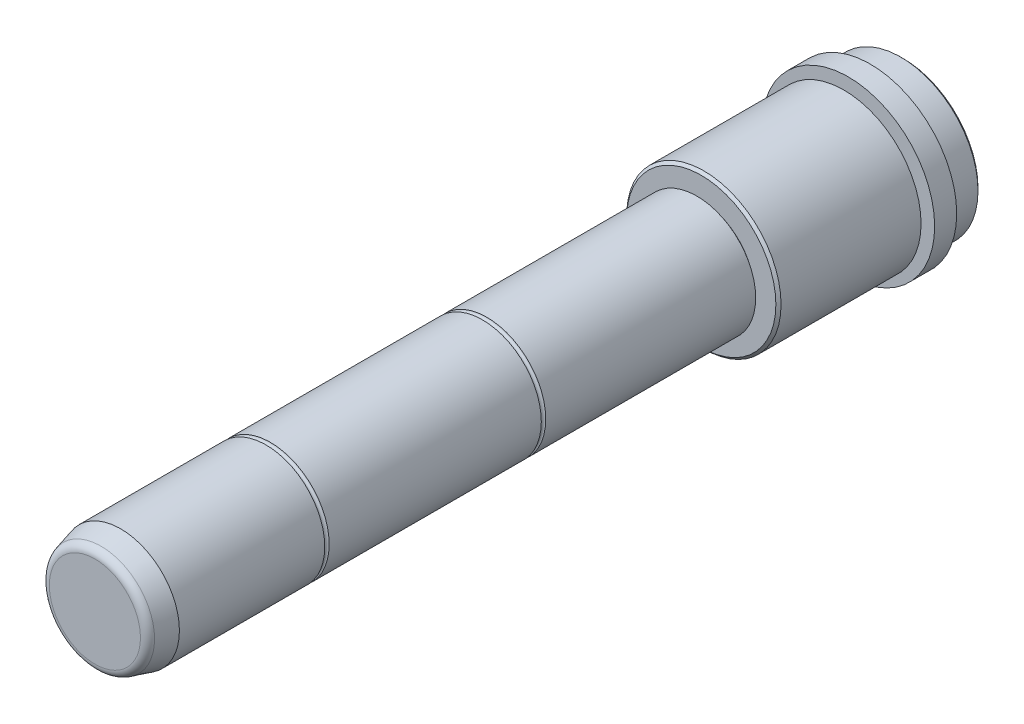
ISO-10303-21;
HEADER;
FILE_DESCRIPTION(('STEP AP214'),'2;1');
FILE_NAME('part.step','',(''),(''),'','','');
FILE_SCHEMA(('AUTOMOTIVE_DESIGN { 1 0 10303 214 1 1 1 1 }'));
ENDSEC;
DATA;
#1=APPLICATION_CONTEXT('core data for automotive mechanical design processes');
#2=APPLICATION_PROTOCOL_DEFINITION('international standard','automotive_design',2000,#1);
#3=PRODUCT_CONTEXT('',#1,'mechanical');
#4=PRODUCT('Part','Part','',(#3));
#5=PRODUCT_RELATED_PRODUCT_CATEGORY('part','',(#4));
#6=PRODUCT_DEFINITION_FORMATION('','',#4);
#7=PRODUCT_DEFINITION_CONTEXT('part definition',#1,'design');
#8=PRODUCT_DEFINITION('design','',#6,#7);
#9=PRODUCT_DEFINITION_SHAPE('','',#8);
#10=(LENGTH_UNIT() NAMED_UNIT(*) SI_UNIT(.MILLI.,.METRE.));
#11=(NAMED_UNIT(*) PLANE_ANGLE_UNIT() SI_UNIT($,.RADIAN.));
#12=(NAMED_UNIT(*) SI_UNIT($,.STERADIAN.) SOLID_ANGLE_UNIT());
#13=UNCERTAINTY_MEASURE_WITH_UNIT(LENGTH_MEASURE(1.E-05),#10,'distance_accuracy_value','');
#14=(GEOMETRIC_REPRESENTATION_CONTEXT(3) GLOBAL_UNCERTAINTY_ASSIGNED_CONTEXT((#13)) GLOBAL_UNIT_ASSIGNED_CONTEXT((#10,
#11,#12)) REPRESENTATION_CONTEXT('',''));
#15=CARTESIAN_POINT('',(0.,0.,0.));
#16=DIRECTION('',(0.,0.,1.));
#17=DIRECTION('',(1.,0.,0.));
#18=AXIS2_PLACEMENT_3D('',#15,#16,#17);
#19=CARTESIAN_POINT('',(0.,0.,55.));
#20=DIRECTION('',(0.,0.,1.));
#21=DIRECTION('',(1.,0.,0.));
#22=AXIS2_PLACEMENT_3D('',#19,#20,#21);
#23=CYLINDRICAL_SURFACE('',#22,16.);
#24=CARTESIAN_POINT('',(-1.99840144432528E-12,0.,56.2));
#25=DIRECTION('',(0.,0.,1.));
#26=DIRECTION('',(1.,0.,0.));
#27=AXIS2_PLACEMENT_3D('',#24,#25,#26);
#28=CIRCLE('',#27,16.);
#29=CARTESIAN_POINT('',(15.999999999998,0.,56.2));
#30=VERTEX_POINT('',#29);
#31=EDGE_CURVE('E82',#30,#30,#28,.T.);
#32=ORIENTED_EDGE('',*,*,#31,.T.);
#33=EDGE_LOOP('',(#32));
#34=FACE_BOUND('',#33,.T.);
#35=CARTESIAN_POINT('',(0.,0.,113.328570957142));
#36=DIRECTION('',(0.,0.,1.));
#37=DIRECTION('',(1.,0.,0.));
#38=AXIS2_PLACEMENT_3D('',#35,#36,#37);
#39=CIRCLE('',#38,16.);
#40=CARTESIAN_POINT('',(16.,0.,113.328570957142));
#41=VERTEX_POINT('',#40);
#42=EDGE_CURVE('E100',#41,#41,#39,.T.);
#43=ORIENTED_EDGE('',*,*,#42,.F.);
#44=EDGE_LOOP('',(#43));
#45=FACE_BOUND('',#44,.T.);
#46=ADVANCED_FACE('F32',(#34,#45),#23,.T.);
#47=CARTESIAN_POINT('',(0.,0.,55.));
#48=DIRECTION('',(0.,0.,-1.));
#49=DIRECTION('',(-1.,0.,0.));
#50=AXIS2_PLACEMENT_3D('',#47,#48,#49);
#51=PLANE('',#50);
#52=CARTESIAN_POINT('',(0.,0.,55.));
#53=DIRECTION('',(0.,0.,1.));
#54=DIRECTION('',(1.,0.,0.));
#55=AXIS2_PLACEMENT_3D('',#52,#53,#54);
#56=CIRCLE('',#55,20.2928932188134);
#57=CARTESIAN_POINT('',(20.2928932188134,0.,55.));
#58=VERTEX_POINT('',#57);
#59=EDGE_CURVE('E73',#58,#58,#56,.T.);
#60=ORIENTED_EDGE('',*,*,#59,.T.);
#61=EDGE_LOOP('',(#60));
#62=FACE_BOUND('',#61,.T.);
#63=CARTESIAN_POINT('',(0.,0.,55.));
#64=DIRECTION('',(0.,0.,1.));
#65=DIRECTION('',(1.,0.,0.));
#66=AXIS2_PLACEMENT_3D('',#63,#64,#65);
#67=CIRCLE('',#66,14.4);
#68=CARTESIAN_POINT('',(14.4,0.,55.));
#69=VERTEX_POINT('',#68);
#70=EDGE_CURVE('E79',#69,#69,#67,.T.);
#71=ORIENTED_EDGE('',*,*,#70,.F.);
#72=EDGE_LOOP('',(#71));
#73=FACE_BOUND('',#72,.T.);
#74=ADVANCED_FACE('F127',(#62,#73),#51,.F.);
#75=CARTESIAN_POINT('',(-1.99840144432528E-12,0.,15.));
#76=DIRECTION('',(0.,0.,1.));
#77=DIRECTION('',(1.,0.,0.));
#78=AXIS2_PLACEMENT_3D('',#75,#76,#77);
#79=CYLINDRICAL_SURFACE('',#78,21.);
#80=CARTESIAN_POINT('',(0.,0.,16.2));
#81=DIRECTION('',(0.,0.,1.));
#82=DIRECTION('',(1.,0.,0.));
#83=AXIS2_PLACEMENT_3D('',#80,#81,#82);
#84=CIRCLE('',#83,21.);
#85=CARTESIAN_POINT('',(21.,0.,16.2));
#86=VERTEX_POINT('',#85);
#87=EDGE_CURVE('E67',#86,#86,#84,.T.);
#88=ORIENTED_EDGE('',*,*,#87,.T.);
#89=EDGE_LOOP('',(#88));
#90=FACE_BOUND('',#89,.T.);
#91=CARTESIAN_POINT('',(0.,0.,54.2928932188134));
#92=DIRECTION('',(0.,0.,1.));
#93=DIRECTION('',(1.,0.,0.));
#94=AXIS2_PLACEMENT_3D('',#91,#92,#93);
#95=CIRCLE('',#94,21.);
#96=CARTESIAN_POINT('',(21.,0.,54.2928932188134));
#97=VERTEX_POINT('',#96);
#98=EDGE_CURVE('E70',#97,#97,#95,.T.);
#99=ORIENTED_EDGE('',*,*,#98,.F.);
#100=EDGE_LOOP('',(#99));
#101=FACE_BOUND('',#100,.T.);
#102=ADVANCED_FACE('F134',(#90,#101),#79,.T.);
#103=CARTESIAN_POINT('',(-1.99840144432528E-12,0.,15.));
#104=DIRECTION('',(0.,0.,-1.));
#105=DIRECTION('',(-1.,0.,0.));
#106=AXIS2_PLACEMENT_3D('',#103,#104,#105);
#107=PLANE('',#106);
#108=CARTESIAN_POINT('',(-1.99840144432528E-12,0.,15.));
#109=DIRECTION('',(0.,0.,1.));
#110=DIRECTION('',(1.,0.,0.));
#111=AXIS2_PLACEMENT_3D('',#108,#109,#110);
#112=CIRCLE('',#111,23.5);
#113=CARTESIAN_POINT('',(23.499999999998,0.,15.));
#114=VERTEX_POINT('',#113);
#115=EDGE_CURVE('E55',#114,#114,#112,.T.);
#116=ORIENTED_EDGE('',*,*,#115,.T.);
#117=EDGE_LOOP('',(#116));
#118=FACE_BOUND('',#117,.T.);
#119=CARTESIAN_POINT('',(-1.99840144432528E-12,0.,15.));
#120=DIRECTION('',(0.,0.,1.));
#121=DIRECTION('',(1.,0.,0.));
#122=AXIS2_PLACEMENT_3D('',#119,#120,#121);
#123=CIRCLE('',#122,18.9);
#124=CARTESIAN_POINT('',(18.899999999998,0.,15.));
#125=VERTEX_POINT('',#124);
#126=EDGE_CURVE('E64',#125,#125,#123,.T.);
#127=ORIENTED_EDGE('',*,*,#126,.F.);
#128=EDGE_LOOP('',(#127));
#129=FACE_BOUND('',#128,.T.);
#130=ADVANCED_FACE('F187',(#118,#129),#107,.F.);
#131=CARTESIAN_POINT('',(0.,0.,0.));
#132=DIRECTION('',(0.,0.,1.));
#133=DIRECTION('',(1.,0.,0.));
#134=AXIS2_PLACEMENT_3D('',#131,#132,#133);
#135=CYLINDRICAL_SURFACE('',#134,21.);
#136=CARTESIAN_POINT('',(0.,0.,0.707106781186545));
#137=DIRECTION('',(0.,0.,1.));
#138=DIRECTION('',(1.,0.,0.));
#139=AXIS2_PLACEMENT_3D('',#136,#137,#138);
#140=CIRCLE('',#139,21.);
#141=CARTESIAN_POINT('',(21.,0.,0.707106781186545));
#142=VERTEX_POINT('',#141);
#143=EDGE_CURVE('E39',#142,#142,#140,.T.);
#144=ORIENTED_EDGE('',*,*,#143,.T.);
#145=EDGE_LOOP('',(#144));
#146=FACE_BOUND('',#145,.T.);
#147=CARTESIAN_POINT('',(0.,0.,7.8));
#148=DIRECTION('',(0.,0.,1.));
#149=DIRECTION('',(1.,0.,0.));
#150=AXIS2_PLACEMENT_3D('',#147,#148,#149);
#151=CIRCLE('',#150,21.);
#152=CARTESIAN_POINT('',(21.,0.,7.8));
#153=VERTEX_POINT('',#152);
#154=EDGE_CURVE('E52',#153,#153,#151,.T.);
#155=ORIENTED_EDGE('',*,*,#154,.F.);
#156=EDGE_LOOP('',(#155));
#157=FACE_BOUND('',#156,.T.);
#158=ADVANCED_FACE('F34',(#146,#157),#135,.T.);
#159=CARTESIAN_POINT('',(0.,0.,0.707106781186545));
#160=DIRECTION('',(0.,0.,1.));
#161=DIRECTION('',(1.,0.,0.));
#162=AXIS2_PLACEMENT_3D('',#159,#160,#161);
#163=CONICAL_SURFACE('',#162,21.,0.785398163397449);
#164=CARTESIAN_POINT('',(0.,0.,0.));
#165=DIRECTION('',(0.,0.,1.));
#166=DIRECTION('',(1.,0.,0.));
#167=AXIS2_PLACEMENT_3D('',#164,#165,#166);
#168=CIRCLE('',#167,20.2928932188135);
#169=CARTESIAN_POINT('',(20.2928932188135,0.,0.));
#170=VERTEX_POINT('',#169);
#171=EDGE_CURVE('E10',#170,#170,#168,.T.);
#172=ORIENTED_EDGE('',*,*,#171,.T.);
#173=EDGE_LOOP('',(#172));
#174=FACE_BOUND('',#173,.T.);
#175=ORIENTED_EDGE('',*,*,#143,.F.);
#176=EDGE_LOOP('',(#175));
#177=FACE_BOUND('',#176,.T.);
#178=ADVANCED_FACE('F209',(#174,#177),#163,.T.);
#179=CARTESIAN_POINT('',(0.,21.,0.));
#180=DIRECTION('',(0.,0.,1.));
#181=DIRECTION('',(1.,0.,0.));
#182=AXIS2_PLACEMENT_3D('',#179,#180,#181);
#183=PLANE('',#182);
#184=ORIENTED_EDGE('',*,*,#171,.F.);
#185=EDGE_LOOP('',(#184));
#186=FACE_BOUND('',#185,.T.);
#187=ADVANCED_FACE('F207',(#186),#183,.F.);
#188=CARTESIAN_POINT('',(0.,0.,0.));
#189=DIRECTION('',(0.,0.,1.));
#190=DIRECTION('',(1.,0.,0.));
#191=AXIS2_PLACEMENT_3D('',#188,#189,#190);
#192=CYLINDRICAL_SURFACE('',#191,18.9);
#193=CARTESIAN_POINT('',(0.,0.,7.8));
#194=DIRECTION('',(0.,0.,1.));
#195=DIRECTION('',(1.,0.,0.));
#196=AXIS2_PLACEMENT_3D('',#193,#194,#195);
#197=CIRCLE('',#196,18.9);
#198=CARTESIAN_POINT('',(18.9,0.,7.8));
#199=VERTEX_POINT('',#198);
#200=EDGE_CURVE('E47',#199,#199,#197,.T.);
#201=ORIENTED_EDGE('',*,*,#200,.T.);
#202=EDGE_LOOP('',(#201));
#203=FACE_BOUND('',#202,.T.);
#204=CARTESIAN_POINT('',(-1.99840144432528E-12,0.,9.00000000000001));
#205=DIRECTION('',(0.,0.,1.));
#206=DIRECTION('',(1.,0.,0.));
#207=AXIS2_PLACEMENT_3D('',#204,#205,#206);
#208=CIRCLE('',#207,18.9);
#209=CARTESIAN_POINT('',(18.899999999998,0.,9.00000000000001));
#210=VERTEX_POINT('',#209);
#211=EDGE_CURVE('E43',#210,#210,#208,.T.);
#212=ORIENTED_EDGE('',*,*,#211,.F.);
#213=EDGE_LOOP('',(#212));
#214=FACE_BOUND('',#213,.T.);
#215=ADVANCED_FACE('F203',(#203,#214),#192,.T.);
#216=CARTESIAN_POINT('',(0.,18.9,7.8));
#217=DIRECTION('',(0.,0.,1.));
#218=DIRECTION('',(1.,0.,0.));
#219=AXIS2_PLACEMENT_3D('',#216,#217,#218);
#220=PLANE('',#219);
#221=ORIENTED_EDGE('',*,*,#154,.T.);
#222=EDGE_LOOP('',(#221));
#223=FACE_BOUND('',#222,.T.);
#224=ORIENTED_EDGE('',*,*,#200,.F.);
#225=EDGE_LOOP('',(#224));
#226=FACE_BOUND('',#225,.T.);
#227=ADVANCED_FACE('F196',(#223,#226),#220,.T.);
#228=CARTESIAN_POINT('',(-1.99840144432528E-12,0.,9.00000000000001));
#229=DIRECTION('',(0.,0.,1.));
#230=DIRECTION('',(1.,0.,0.));
#231=AXIS2_PLACEMENT_3D('',#228,#229,#230);
#232=CYLINDRICAL_SURFACE('',#231,23.5);
#233=ORIENTED_EDGE('',*,*,#115,.F.);
#234=EDGE_LOOP('',(#233));
#235=FACE_BOUND('',#234,.T.);
#236=CARTESIAN_POINT('',(-1.99840144432528E-12,0.,9.00000000000001));
#237=DIRECTION('',(0.,0.,1.));
#238=DIRECTION('',(1.,0.,0.));
#239=AXIS2_PLACEMENT_3D('',#236,#237,#238);
#240=CIRCLE('',#239,23.5);
#241=CARTESIAN_POINT('',(23.499999999998,0.,9.00000000000001));
#242=VERTEX_POINT('',#241);
#243=EDGE_CURVE('E58',#242,#242,#240,.T.);
#244=ORIENTED_EDGE('',*,*,#243,.T.);
#245=EDGE_LOOP('',(#244));
#246=FACE_BOUND('',#245,.T.);
#247=ADVANCED_FACE('F192',(#235,#246),#232,.T.);
#248=CARTESIAN_POINT('',(-1.99840144432528E-12,23.5,9.00000000000001));
#249=DIRECTION('',(0.,0.,1.));
#250=DIRECTION('',(1.,0.,0.));
#251=AXIS2_PLACEMENT_3D('',#248,#249,#250);
#252=PLANE('',#251);
#253=ORIENTED_EDGE('',*,*,#211,.T.);
#254=EDGE_LOOP('',(#253));
#255=FACE_BOUND('',#254,.T.);
#256=ORIENTED_EDGE('',*,*,#243,.F.);
#257=EDGE_LOOP('',(#256));
#258=FACE_BOUND('',#257,.T.);
#259=ADVANCED_FACE('F184',(#255,#258),#252,.F.);
#260=CARTESIAN_POINT('',(0.,21.,16.2));
#261=DIRECTION('',(0.,0.,-1.));
#262=DIRECTION('',(-1.,0.,0.));
#263=AXIS2_PLACEMENT_3D('',#260,#261,#262);
#264=PLANE('',#263);
#265=CARTESIAN_POINT('',(0.,0.,16.2));
#266=DIRECTION('',(0.,0.,1.));
#267=DIRECTION('',(1.,0.,0.));
#268=AXIS2_PLACEMENT_3D('',#265,#266,#267);
#269=CIRCLE('',#268,18.9);
#270=CARTESIAN_POINT('',(18.9,0.,16.2));
#271=VERTEX_POINT('',#270);
#272=EDGE_CURVE('E61',#271,#271,#269,.T.);
#273=ORIENTED_EDGE('',*,*,#272,.T.);
#274=EDGE_LOOP('',(#273));
#275=FACE_BOUND('',#274,.T.);
#276=ORIENTED_EDGE('',*,*,#87,.F.);
#277=EDGE_LOOP('',(#276));
#278=FACE_BOUND('',#277,.T.);
#279=ADVANCED_FACE('F177',(#275,#278),#264,.T.);
#280=CARTESIAN_POINT('',(-1.99840144432528E-12,0.,15.));
#281=DIRECTION('',(0.,0.,1.));
#282=DIRECTION('',(1.,0.,0.));
#283=AXIS2_PLACEMENT_3D('',#280,#281,#282);
#284=CYLINDRICAL_SURFACE('',#283,18.9);
#285=ORIENTED_EDGE('',*,*,#126,.T.);
#286=EDGE_LOOP('',(#285));
#287=FACE_BOUND('',#286,.T.);
#288=ORIENTED_EDGE('',*,*,#272,.F.);
#289=EDGE_LOOP('',(#288));
#290=FACE_BOUND('',#289,.T.);
#291=ADVANCED_FACE('F167',(#287,#290),#284,.T.);
#292=CARTESIAN_POINT('',(0.,0.,55.));
#293=DIRECTION('',(0.,0.,-1.));
#294=DIRECTION('',(-1.,0.,0.));
#295=AXIS2_PLACEMENT_3D('',#292,#293,#294);
#296=CONICAL_SURFACE('',#295,20.2928932188134,0.785398163397461);
#297=ORIENTED_EDGE('',*,*,#98,.T.);
#298=EDGE_LOOP('',(#297));
#299=FACE_BOUND('',#298,.T.);
#300=ORIENTED_EDGE('',*,*,#59,.F.);
#301=EDGE_LOOP('',(#300));
#302=FACE_BOUND('',#301,.T.);
#303=ADVANCED_FACE('F162',(#299,#302),#296,.T.);
#304=CARTESIAN_POINT('',(-1.99840144432528E-12,16.,56.2));
#305=DIRECTION('',(0.,0.,-1.));
#306=DIRECTION('',(-1.,0.,0.));
#307=AXIS2_PLACEMENT_3D('',#304,#305,#306);
#308=PLANE('',#307);
#309=CARTESIAN_POINT('',(-1.99840144432528E-12,0.,56.2));
#310=DIRECTION('',(0.,0.,1.));
#311=DIRECTION('',(1.,0.,0.));
#312=AXIS2_PLACEMENT_3D('',#309,#310,#311);
#313=CIRCLE('',#312,14.4);
#314=CARTESIAN_POINT('',(14.399999999998,0.,56.2));
#315=VERTEX_POINT('',#314);
#316=EDGE_CURVE('E76',#315,#315,#313,.T.);
#317=ORIENTED_EDGE('',*,*,#316,.T.);
#318=EDGE_LOOP('',(#317));
#319=FACE_BOUND('',#318,.T.);
#320=ORIENTED_EDGE('',*,*,#31,.F.);
#321=EDGE_LOOP('',(#320));
#322=FACE_BOUND('',#321,.T.);
#323=ADVANCED_FACE('F122',(#319,#322),#308,.T.);
#324=CARTESIAN_POINT('',(0.,0.,55.));
#325=DIRECTION('',(0.,0.,1.));
#326=DIRECTION('',(1.,0.,0.));
#327=AXIS2_PLACEMENT_3D('',#324,#325,#326);
#328=CYLINDRICAL_SURFACE('',#327,14.4);
#329=ORIENTED_EDGE('',*,*,#70,.T.);
#330=EDGE_LOOP('',(#329));
#331=FACE_BOUND('',#330,.T.);
#332=ORIENTED_EDGE('',*,*,#316,.F.);
#333=EDGE_LOOP('',(#332));
#334=FACE_BOUND('',#333,.T.);
#335=ADVANCED_FACE('F112',(#331,#334),#328,.T.);
#336=CARTESIAN_POINT('',(0.,0.,113.928570957142));
#337=DIRECTION('',(0.,0.,1.));
#338=DIRECTION('',(1.,0.,0.));
#339=AXIS2_PLACEMENT_3D('',#336,#337,#338);
#340=TOROIDAL_SURFACE('',#339,16.,0.599999999999996);
#341=ORIENTED_EDGE('',*,*,#42,.T.);
#342=EDGE_LOOP('',(#341));
#343=FACE_BOUND('',#342,.T.);
#344=CARTESIAN_POINT('',(0.,0.,114.528570957142));
#345=DIRECTION('',(0.,0.,1.));
#346=DIRECTION('',(1.,0.,0.));
#347=AXIS2_PLACEMENT_3D('',#344,#345,#346);
#348=CIRCLE('',#347,16.);
#349=CARTESIAN_POINT('',(16.,0.,114.528570957142));
#350=VERTEX_POINT('',#349);
#351=EDGE_CURVE('E103',#350,#350,#348,.T.);
#352=ORIENTED_EDGE('',*,*,#351,.F.);
#353=EDGE_LOOP('',(#352));
#354=FACE_BOUND('',#353,.T.);
#355=ADVANCED_FACE('F109',(#343,#354),#340,.F.);
#356=CARTESIAN_POINT('',(-1.99840144432528E-12,-1.11022302462516E-13,219.999999999999));
#357=DIRECTION('',(0.,0.,-1.));
#358=DIRECTION('',(-1.,0.,0.));
#359=AXIS2_PLACEMENT_3D('',#356,#357,#358);
#360=PLANE('',#359);
#361=CARTESIAN_POINT('',(-1.99840144432528E-12,-1.11022302462516E-13,219.999999999999));
#362=DIRECTION('',(0.,0.,1.));
#363=DIRECTION('',(1.,0.,0.));
#364=AXIS2_PLACEMENT_3D('',#361,#362,#363);
#365=CIRCLE('',#364,12.3978699300295);
#366=CARTESIAN_POINT('',(12.3978699300275,-1.11022302462516E-13,219.999999999999));
#367=VERTEX_POINT('',#366);
#368=EDGE_CURVE('E88',#367,#367,#365,.T.);
#369=ORIENTED_EDGE('',*,*,#368,.T.);
#370=EDGE_LOOP('',(#369));
#371=FACE_BOUND('',#370,.T.);
#372=ADVANCED_FACE('F111',(#371),#360,.F.);
#373=CARTESIAN_POINT('',(-1.99840144432528E-12,-1.11022302462516E-13,217.75));
#374=DIRECTION('',(0.,0.,1.));
#375=DIRECTION('',(1.,0.,0.));
#376=AXIS2_PLACEMENT_3D('',#373,#374,#375);
#377=TOROIDAL_SURFACE('',#376,12.3978699300295,2.24999999999996);
#378=CARTESIAN_POINT('',(-1.99840144432528E-12,-1.11022302462516E-13,218.33234285148));
#379=DIRECTION('',(0.,0.,1.));
#380=DIRECTION('',(1.,0.,0.));
#381=AXIS2_PLACEMENT_3D('',#378,#379,#380);
#382=CIRCLE('',#381,14.5712030391799);
#383=CARTESIAN_POINT('',(14.5712030391779,-1.11022302462516E-13,218.33234285148));
#384=VERTEX_POINT('',#383);
#385=EDGE_CURVE('E91',#384,#384,#382,.T.);
#386=ORIENTED_EDGE('',*,*,#385,.T.);
#387=EDGE_LOOP('',(#386));
#388=FACE_BOUND('',#387,.T.);
#389=ORIENTED_EDGE('',*,*,#368,.F.);
#390=EDGE_LOOP('',(#389));
#391=FACE_BOUND('',#390,.T.);
#392=ADVANCED_FACE('F119',(#388,#391),#377,.T.);
#393=CARTESIAN_POINT('',(-1.99840144432528E-12,-1.11022302462516E-13,219.999999999999));
#394=DIRECTION('',(0.,0.,-1.));
#395=DIRECTION('',(-1.,0.,0.));
#396=AXIS2_PLACEMENT_3D('',#393,#394,#395);
#397=CONICAL_SURFACE('',#396,14.1243556529822,0.261799387799148);
#398=ORIENTED_EDGE('',*,*,#385,.F.);
#399=EDGE_LOOP('',(#398));
#400=FACE_BOUND('',#399,.T.);
#401=CARTESIAN_POINT('',(0.,-1.11022302462516E-13,213.));
#402=DIRECTION('',(0.,0.,1.));
#403=DIRECTION('',(1.,0.,0.));
#404=AXIS2_PLACEMENT_3D('',#401,#402,#403);
#405=CIRCLE('',#404,16.);
#406=CARTESIAN_POINT('',(16.,-1.11022302462516E-13,213.));
#407=VERTEX_POINT('',#406);
#408=EDGE_CURVE('E85',#407,#407,#405,.T.);
#409=ORIENTED_EDGE('',*,*,#408,.T.);
#410=EDGE_LOOP('',(#409));
#411=FACE_BOUND('',#410,.T.);
#412=ADVANCED_FACE('F141',(#400,#411),#397,.T.);
#413=ORIENTED_EDGE('',*,*,#408,.F.);
#414=EDGE_LOOP('',(#413));
#415=FACE_BOUND('',#414,.T.);
#416=CARTESIAN_POINT('',(-1.99840144432528E-12,0.,173.457142857142));
#417=DIRECTION('',(0.,0.,1.));
#418=DIRECTION('',(1.,0.,0.));
#419=AXIS2_PLACEMENT_3D('',#416,#417,#418);
#420=CIRCLE('',#419,16.);
#421=CARTESIAN_POINT('',(15.999999999998,0.,173.457142857142));
#422=VERTEX_POINT('',#421);
#423=EDGE_CURVE('E97',#422,#422,#420,.T.);
#424=ORIENTED_EDGE('',*,*,#423,.T.);
#425=EDGE_LOOP('',(#424));
#426=FACE_BOUND('',#425,.T.);
#427=ADVANCED_FACE('F130',(#415,#426),#23,.T.);
#428=CARTESIAN_POINT('',(-1.99840144432528E-12,0.,172.857142857142));
#429=DIRECTION('',(0.,0.,1.));
#430=DIRECTION('',(1.,0.,0.));
#431=AXIS2_PLACEMENT_3D('',#428,#429,#430);
#432=TOROIDAL_SURFACE('',#431,16.,0.600000000000003);
#433=CARTESIAN_POINT('',(-1.99840144432528E-12,0.,172.257142857142));
#434=DIRECTION('',(0.,0.,1.));
#435=DIRECTION('',(1.,0.,0.));
#436=AXIS2_PLACEMENT_3D('',#433,#434,#435);
#437=CIRCLE('',#436,16.);
#438=CARTESIAN_POINT('',(15.999999999998,0.,172.257142857142));
#439=VERTEX_POINT('',#438);
#440=EDGE_CURVE('E94',#439,#439,#437,.T.);
#441=ORIENTED_EDGE('',*,*,#440,.T.);
#442=EDGE_LOOP('',(#441));
#443=FACE_BOUND('',#442,.T.);
#444=ORIENTED_EDGE('',*,*,#423,.F.);
#445=EDGE_LOOP('',(#444));
#446=FACE_BOUND('',#445,.T.);
#447=ADVANCED_FACE('F140',(#443,#446),#432,.F.);
#448=ORIENTED_EDGE('',*,*,#440,.F.);
#449=EDGE_LOOP('',(#448));
#450=FACE_BOUND('',#449,.T.);
#451=ORIENTED_EDGE('',*,*,#351,.T.);
#452=EDGE_LOOP('',(#451));
#453=FACE_BOUND('',#452,.T.);
#454=ADVANCED_FACE('F107',(#450,#453),#23,.T.);
#455=CLOSED_SHELL('',(#46,#74,#102,#130,#158,#178,#187,#215,#227,#247,#259,#279,#291,#303,#323,
#335,#355,#372,#392,#412,#427,#447,#454));
#456=MANIFOLD_SOLID_BREP('B2',#455);
#457=ADVANCED_BREP_SHAPE_REPRESENTATION('',(#18,#456),#14);
#458=SHAPE_DEFINITION_REPRESENTATION(#9,#457);
ENDSEC;
END-ISO-10303-21;
